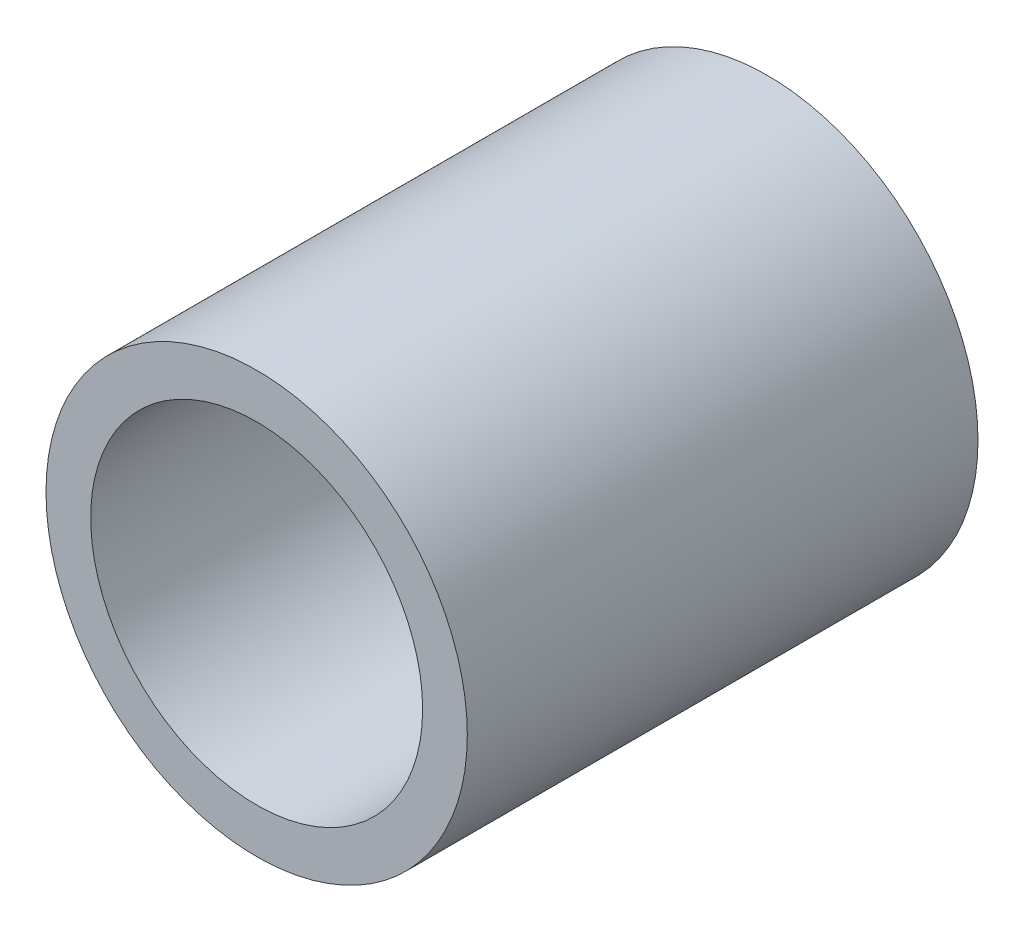
ISO-10303-21;
HEADER;
FILE_DESCRIPTION(('STEP AP214'),'2;1');
FILE_NAME('part.step','',(''),(''),'','','');
FILE_SCHEMA(('AUTOMOTIVE_DESIGN { 1 0 10303 214 1 1 1 1 }'));
ENDSEC;
DATA;
#1=APPLICATION_CONTEXT('core data for automotive mechanical design processes');
#2=APPLICATION_PROTOCOL_DEFINITION('international standard','automotive_design',2000,#1);
#3=PRODUCT_CONTEXT('',#1,'mechanical');
#4=PRODUCT('Part','Part','',(#3));
#5=PRODUCT_RELATED_PRODUCT_CATEGORY('part','',(#4));
#6=PRODUCT_DEFINITION_FORMATION('','',#4);
#7=PRODUCT_DEFINITION_CONTEXT('part definition',#1,'design');
#8=PRODUCT_DEFINITION('design','',#6,#7);
#9=PRODUCT_DEFINITION_SHAPE('','',#8);
#10=(LENGTH_UNIT() NAMED_UNIT(*) SI_UNIT(.MILLI.,.METRE.));
#11=(NAMED_UNIT(*) PLANE_ANGLE_UNIT() SI_UNIT($,.RADIAN.));
#12=(NAMED_UNIT(*) SI_UNIT($,.STERADIAN.) SOLID_ANGLE_UNIT());
#13=UNCERTAINTY_MEASURE_WITH_UNIT(LENGTH_MEASURE(1.E-05),#10,'distance_accuracy_value','');
#14=(GEOMETRIC_REPRESENTATION_CONTEXT(3) GLOBAL_UNCERTAINTY_ASSIGNED_CONTEXT((#13)) GLOBAL_UNIT_ASSIGNED_CONTEXT((#10,
#11,#12)) REPRESENTATION_CONTEXT('',''));
#15=CARTESIAN_POINT('',(0.,0.,0.));
#16=DIRECTION('',(0.,0.,1.));
#17=DIRECTION('',(1.,0.,0.));
#18=AXIS2_PLACEMENT_3D('',#15,#16,#17);
#19=CARTESIAN_POINT('',(0.,0.,8.));
#20=DIRECTION('',(0.,0.,1.));
#21=DIRECTION('',(1.,0.,0.));
#22=AXIS2_PLACEMENT_3D('',#19,#20,#21);
#23=PLANE('',#22);
#24=CARTESIAN_POINT('',(0.,0.,8.));
#25=DIRECTION('',(0.,0.,1.));
#26=DIRECTION('',(1.,0.,0.));
#27=AXIS2_PLACEMENT_3D('',#24,#25,#26);
#28=CIRCLE('',#27,3.3);
#29=CARTESIAN_POINT('',(3.3,0.,8.));
#30=VERTEX_POINT('',#29);
#31=EDGE_CURVE('E10',#30,#30,#28,.T.);
#32=ORIENTED_EDGE('',*,*,#31,.T.);
#33=EDGE_LOOP('',(#32));
#34=FACE_BOUND('',#33,.T.);
#35=CARTESIAN_POINT('',(0.,0.,8.));
#36=DIRECTION('',(0.,0.,1.));
#37=DIRECTION('',(1.,0.,0.));
#38=AXIS2_PLACEMENT_3D('',#35,#36,#37);
#39=CIRCLE('',#38,2.6);
#40=CARTESIAN_POINT('',(2.6,0.,8.));
#41=VERTEX_POINT('',#40);
#42=EDGE_CURVE('E60',#41,#41,#39,.T.);
#43=ORIENTED_EDGE('',*,*,#42,.F.);
#44=EDGE_LOOP('',(#43));
#45=FACE_BOUND('',#44,.T.);
#46=ADVANCED_FACE('F45',(#34,#45),#23,.T.);
#47=CARTESIAN_POINT('',(0.,0.,0.));
#48=DIRECTION('',(0.,0.,1.));
#49=DIRECTION('',(1.,0.,0.));
#50=AXIS2_PLACEMENT_3D('',#47,#48,#49);
#51=PLANE('',#50);
#52=CARTESIAN_POINT('',(0.,0.,0.));
#53=DIRECTION('',(0.,0.,1.));
#54=DIRECTION('',(1.,0.,0.));
#55=AXIS2_PLACEMENT_3D('',#52,#53,#54);
#56=CIRCLE('',#55,3.3);
#57=CARTESIAN_POINT('',(3.3,0.,0.));
#58=VERTEX_POINT('',#57);
#59=EDGE_CURVE('E49',#58,#58,#56,.T.);
#60=ORIENTED_EDGE('',*,*,#59,.F.);
#61=EDGE_LOOP('',(#60));
#62=FACE_BOUND('',#61,.T.);
#63=CARTESIAN_POINT('',(0.,0.,0.));
#64=DIRECTION('',(0.,0.,1.));
#65=DIRECTION('',(1.,0.,0.));
#66=AXIS2_PLACEMENT_3D('',#63,#64,#65);
#67=CIRCLE('',#66,2.6);
#68=CARTESIAN_POINT('',(2.6,0.,0.));
#69=VERTEX_POINT('',#68);
#70=EDGE_CURVE('E62',#69,#69,#67,.T.);
#71=ORIENTED_EDGE('',*,*,#70,.T.);
#72=EDGE_LOOP('',(#71));
#73=FACE_BOUND('',#72,.T.);
#74=ADVANCED_FACE('F74',(#62,#73),#51,.F.);
#75=CARTESIAN_POINT('',(0.,0.,8.));
#76=DIRECTION('',(0.,0.,-1.));
#77=DIRECTION('',(-1.,0.,0.));
#78=AXIS2_PLACEMENT_3D('',#75,#76,#77);
#79=CYLINDRICAL_SURFACE('',#78,3.3);
#80=ORIENTED_EDGE('',*,*,#31,.F.);
#81=EDGE_LOOP('',(#80));
#82=FACE_BOUND('',#81,.T.);
#83=ORIENTED_EDGE('',*,*,#59,.T.);
#84=EDGE_LOOP('',(#83));
#85=FACE_BOUND('',#84,.T.);
#86=ADVANCED_FACE('F47',(#82,#85),#79,.T.);
#87=CARTESIAN_POINT('',(0.,0.,8.));
#88=DIRECTION('',(0.,0.,-1.));
#89=DIRECTION('',(-1.,0.,0.));
#90=AXIS2_PLACEMENT_3D('',#87,#88,#89);
#91=CYLINDRICAL_SURFACE('',#90,2.6);
#92=ORIENTED_EDGE('',*,*,#42,.T.);
#93=EDGE_LOOP('',(#92));
#94=FACE_BOUND('',#93,.T.);
#95=ORIENTED_EDGE('',*,*,#70,.F.);
#96=EDGE_LOOP('',(#95));
#97=FACE_BOUND('',#96,.T.);
#98=ADVANCED_FACE('F70',(#94,#97),#91,.F.);
#99=CLOSED_SHELL('',(#46,#74,#86,#98));
#100=MANIFOLD_SOLID_BREP('B2',#99);
#101=ADVANCED_BREP_SHAPE_REPRESENTATION('',(#18,#100),#14);
#102=SHAPE_DEFINITION_REPRESENTATION(#9,#101);
ENDSEC;
END-ISO-10303-21;
